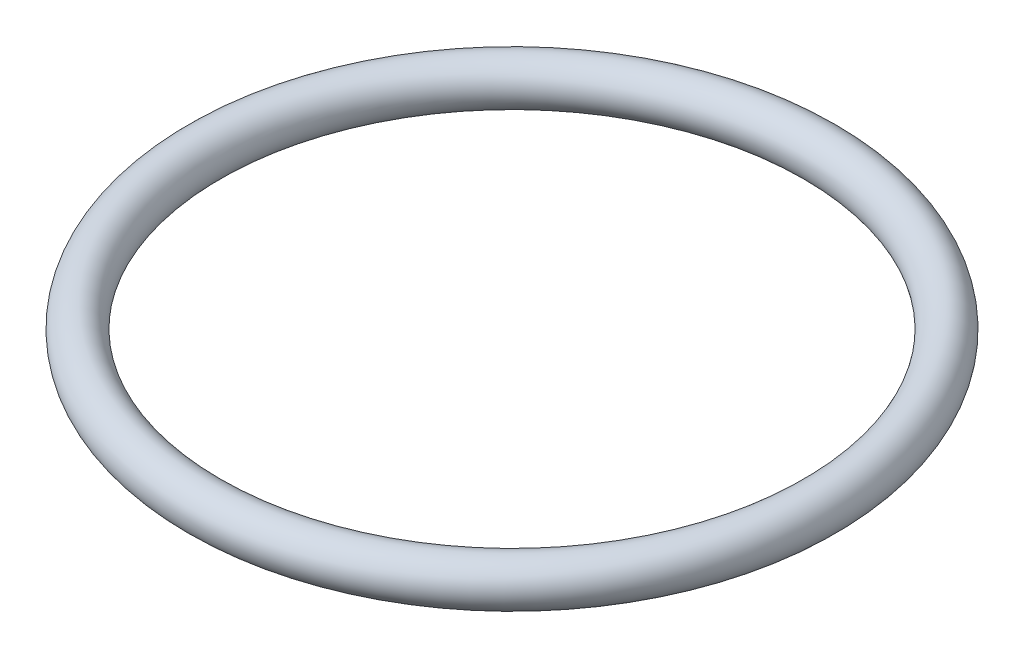
ISO-10303-21;
HEADER;
FILE_DESCRIPTION(('STEP AP214'),'2;1');
FILE_NAME('part.step','',(''),(''),'','','');
FILE_SCHEMA(('AUTOMOTIVE_DESIGN { 1 0 10303 214 1 1 1 1 }'));
ENDSEC;
DATA;
#1=APPLICATION_CONTEXT('core data for automotive mechanical design processes');
#2=APPLICATION_PROTOCOL_DEFINITION('international standard','automotive_design',2000,#1);
#3=PRODUCT_CONTEXT('',#1,'mechanical');
#4=PRODUCT('Part','Part','',(#3));
#5=PRODUCT_RELATED_PRODUCT_CATEGORY('part','',(#4));
#6=PRODUCT_DEFINITION_FORMATION('','',#4);
#7=PRODUCT_DEFINITION_CONTEXT('part definition',#1,'design');
#8=PRODUCT_DEFINITION('design','',#6,#7);
#9=PRODUCT_DEFINITION_SHAPE('','',#8);
#10=(LENGTH_UNIT() NAMED_UNIT(*) SI_UNIT(.MILLI.,.METRE.));
#11=(NAMED_UNIT(*) PLANE_ANGLE_UNIT() SI_UNIT($,.RADIAN.));
#12=(NAMED_UNIT(*) SI_UNIT($,.STERADIAN.) SOLID_ANGLE_UNIT());
#13=UNCERTAINTY_MEASURE_WITH_UNIT(LENGTH_MEASURE(1.E-05),#10,'distance_accuracy_value','');
#14=(GEOMETRIC_REPRESENTATION_CONTEXT(3) GLOBAL_UNCERTAINTY_ASSIGNED_CONTEXT((#13)) GLOBAL_UNIT_ASSIGNED_CONTEXT((#10,
#11,#12)) REPRESENTATION_CONTEXT('',''));
#15=CARTESIAN_POINT('',(0.,0.,0.));
#16=DIRECTION('',(0.,0.,1.));
#17=DIRECTION('',(1.,0.,0.));
#18=AXIS2_PLACEMENT_3D('',#15,#16,#17);
#19=CARTESIAN_POINT('',(0.,0.,0.));
#20=DIRECTION('',(0.,-1.,0.));
#21=DIRECTION('',(0.,0.,-1.));
#22=AXIS2_PLACEMENT_3D('',#19,#20,#21);
#23=TOROIDAL_SURFACE('',#22,6.9,0.500000000000001);
#24=CARTESIAN_POINT('',(0.,0.,-7.4));
#25=VERTEX_POINT('',#24);
#26=VERTEX_LOOP('',#25);
#27=FACE_BOUND('',#26,.T.);
#28=ADVANCED_FACE('F35',(#27),#23,.T.);
#29=CLOSED_SHELL('',(#28));
#30=MANIFOLD_SOLID_BREP('B2',#29);
#31=ADVANCED_BREP_SHAPE_REPRESENTATION('',(#18,#30),#14);
#32=SHAPE_DEFINITION_REPRESENTATION(#9,#31);
ENDSEC;
END-ISO-10303-21;
